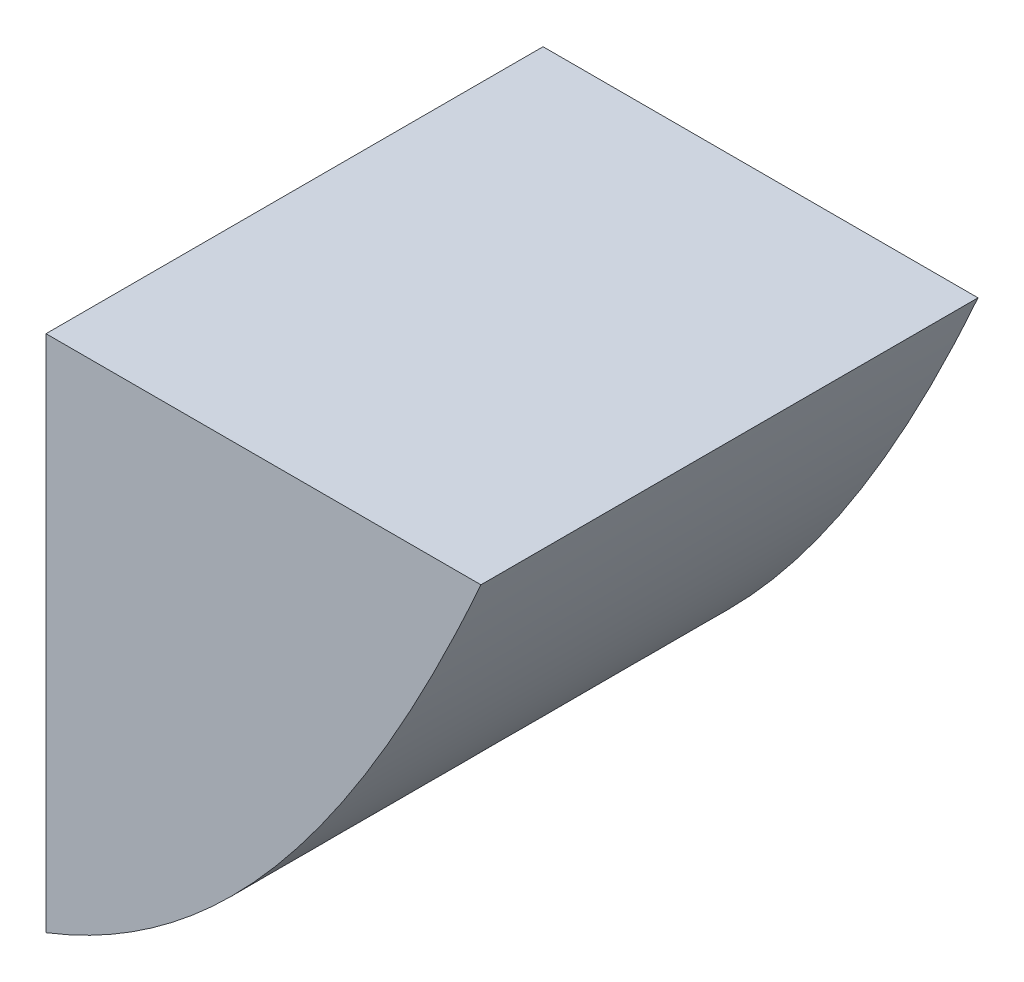
ISO-10303-21;
HEADER;
FILE_DESCRIPTION(('STEP AP214'),'2;1');
FILE_NAME('part.step','',(''),(''),'','','');
FILE_SCHEMA(('AUTOMOTIVE_DESIGN { 1 0 10303 214 1 1 1 1 }'));
ENDSEC;
DATA;
#1=APPLICATION_CONTEXT('core data for automotive mechanical design processes');
#2=APPLICATION_PROTOCOL_DEFINITION('international standard','automotive_design',2000,#1);
#3=PRODUCT_CONTEXT('',#1,'mechanical');
#4=PRODUCT('Part','Part','',(#3));
#5=PRODUCT_RELATED_PRODUCT_CATEGORY('part','',(#4));
#6=PRODUCT_DEFINITION_FORMATION('','',#4);
#7=PRODUCT_DEFINITION_CONTEXT('part definition',#1,'design');
#8=PRODUCT_DEFINITION('design','',#6,#7);
#9=PRODUCT_DEFINITION_SHAPE('','',#8);
#10=(LENGTH_UNIT() NAMED_UNIT(*) SI_UNIT(.MILLI.,.METRE.));
#11=(NAMED_UNIT(*) PLANE_ANGLE_UNIT() SI_UNIT($,.RADIAN.));
#12=(NAMED_UNIT(*) SI_UNIT($,.STERADIAN.) SOLID_ANGLE_UNIT());
#13=UNCERTAINTY_MEASURE_WITH_UNIT(LENGTH_MEASURE(1.E-05),#10,'distance_accuracy_value','');
#14=(GEOMETRIC_REPRESENTATION_CONTEXT(3) GLOBAL_UNCERTAINTY_ASSIGNED_CONTEXT((#13)) GLOBAL_UNIT_ASSIGNED_CONTEXT((#10,
#11,#12)) REPRESENTATION_CONTEXT('',''));
#15=CARTESIAN_POINT('',(0.,0.,0.));
#16=DIRECTION('',(0.,0.,1.));
#17=DIRECTION('',(1.,0.,0.));
#18=AXIS2_PLACEMENT_3D('',#15,#16,#17);
#19=CARTESIAN_POINT('',(0.,0.,8.));
#20=CARTESIAN_POINT('',(4.,0.,8.));
#21=CARTESIAN_POINT('',(8.,0.,8.));
#22=CARTESIAN_POINT('',(12.,9.,8.));
#23=B_SPLINE_CURVE_WITH_KNOTS('',3,(#19,#20,#21,#22),.UNSPECIFIED.,.F.,.F.,(4,4),(0.,1.),.UNSPECIFIED.);
#24=DIRECTION('',(0.,0.,-1.));
#25=VECTOR('',#24,1.);
#26=SURFACE_OF_LINEAR_EXTRUSION('',#23,#25);
#27=DIRECTION('',(0.,0.,-1.));
#28=VECTOR('',#27,1.);
#29=CARTESIAN_POINT('',(5.,0.651041666666666,8.));
#30=LINE('',#29,#28);
#31=CARTESIAN_POINT('',(5.,0.651041666666666,0.));
#32=VERTEX_POINT('',#31);
#33=CARTESIAN_POINT('',(5.,0.651041666666666,8.));
#34=VERTEX_POINT('',#33);
#35=EDGE_CURVE('E76',#32,#34,#30,.F.);
#36=ORIENTED_EDGE('',*,*,#35,.F.);
#37=CARTESIAN_POINT('',(0.,0.,0.));
#38=CARTESIAN_POINT('',(4.,0.,0.));
#39=CARTESIAN_POINT('',(8.,0.,0.));
#40=CARTESIAN_POINT('',(12.,9.,0.));
#41=B_SPLINE_CURVE_WITH_KNOTS('',3,(#37,#38,#39,#40),.UNSPECIFIED.,.F.,.F.,(4,4),(0.,1.),.UNSPECIFIED.);
#42=CARTESIAN_POINT('',(12.,9.,0.));
#43=VERTEX_POINT('',#42);
#44=EDGE_CURVE('E83',#32,#43,#41,.T.);
#45=ORIENTED_EDGE('',*,*,#44,.T.);
#46=DIRECTION('',(0.,0.,-1.));
#47=VECTOR('',#46,1.);
#48=CARTESIAN_POINT('',(12.,9.,8.));
#49=LINE('',#48,#47);
#50=CARTESIAN_POINT('',(12.,9.,8.));
#51=VERTEX_POINT('',#50);
#52=EDGE_CURVE('E49',#51,#43,#49,.T.);
#53=ORIENTED_EDGE('',*,*,#52,.F.);
#54=EDGE_CURVE('E64',#34,#51,#23,.T.);
#55=ORIENTED_EDGE('',*,*,#54,.F.);
#56=EDGE_LOOP('',(#36,#45,#53,#55));
#57=FACE_BOUND('',#56,.T.);
#58=ADVANCED_FACE('F41',(#57),#26,.F.);
#59=CARTESIAN_POINT('',(12.,9.,8.));
#60=DIRECTION('',(0.,-1.,0.));
#61=DIRECTION('',(0.,0.,-1.));
#62=AXIS2_PLACEMENT_3D('',#59,#60,#61);
#63=PLANE('',#62);
#64=DIRECTION('',(0.,0.,-1.));
#65=VECTOR('',#64,1.);
#66=CARTESIAN_POINT('',(5.,9.,8.));
#67=LINE('',#66,#65);
#68=CARTESIAN_POINT('',(5.,9.,8.));
#69=VERTEX_POINT('',#68);
#70=CARTESIAN_POINT('',(5.,9.,0.));
#71=VERTEX_POINT('',#70);
#72=EDGE_CURVE('E56',#69,#71,#67,.T.);
#73=ORIENTED_EDGE('',*,*,#72,.F.);
#74=DIRECTION('',(-1.,0.,0.));
#75=VECTOR('',#74,1.);
#76=CARTESIAN_POINT('',(12.,9.,8.));
#77=LINE('',#76,#75);
#78=EDGE_CURVE('E93',#51,#69,#77,.T.);
#79=ORIENTED_EDGE('',*,*,#78,.F.);
#80=ORIENTED_EDGE('',*,*,#52,.T.);
#81=DIRECTION('',(-1.,0.,0.));
#82=VECTOR('',#81,1.);
#83=CARTESIAN_POINT('',(12.,9.,0.));
#84=LINE('',#83,#82);
#85=EDGE_CURVE('E86',#43,#71,#84,.T.);
#86=ORIENTED_EDGE('',*,*,#85,.T.);
#87=EDGE_LOOP('',(#73,#79,#80,#86));
#88=FACE_BOUND('',#87,.T.);
#89=ADVANCED_FACE('F107',(#88),#63,.F.);
#90=CARTESIAN_POINT('',(6.,1.125,8.));
#91=DIRECTION('',(0.,0.,-1.));
#92=DIRECTION('',(-1.,0.,0.));
#93=AXIS2_PLACEMENT_3D('',#90,#91,#92);
#94=PLANE('',#93);
#95=DIRECTION('',(0.,1.,0.));
#96=VECTOR('',#95,1.);
#97=CARTESIAN_POINT('',(5.,-2.,8.));
#98=LINE('',#97,#96);
#99=EDGE_CURVE('E106',#34,#69,#98,.T.);
#100=ORIENTED_EDGE('',*,*,#99,.F.);
#101=ORIENTED_EDGE('',*,*,#54,.T.);
#102=ORIENTED_EDGE('',*,*,#78,.T.);
#103=EDGE_LOOP('',(#100,#101,#102));
#104=FACE_BOUND('',#103,.T.);
#105=ADVANCED_FACE('F109',(#104),#94,.F.);
#106=CARTESIAN_POINT('',(6.,1.125,0.));
#107=DIRECTION('',(0.,0.,-1.));
#108=DIRECTION('',(-1.,0.,0.));
#109=AXIS2_PLACEMENT_3D('',#106,#107,#108);
#110=PLANE('',#109);
#111=ORIENTED_EDGE('',*,*,#44,.F.);
#112=DIRECTION('',(0.,1.,0.));
#113=VECTOR('',#112,1.);
#114=CARTESIAN_POINT('',(5.,1.125,0.));
#115=LINE('',#114,#113);
#116=EDGE_CURVE('E11',#32,#71,#115,.T.);
#117=ORIENTED_EDGE('',*,*,#116,.T.);
#118=ORIENTED_EDGE('',*,*,#85,.F.);
#119=EDGE_LOOP('',(#111,#117,#118));
#120=FACE_BOUND('',#119,.T.);
#121=ADVANCED_FACE('F85',(#120),#110,.T.);
#122=CARTESIAN_POINT('',(5.,-2.,8.));
#123=DIRECTION('',(-1.,0.,0.));
#124=DIRECTION('',(0.,0.,1.));
#125=AXIS2_PLACEMENT_3D('',#122,#123,#124);
#126=PLANE('',#125);
#127=ORIENTED_EDGE('',*,*,#35,.T.);
#128=ORIENTED_EDGE('',*,*,#99,.T.);
#129=ORIENTED_EDGE('',*,*,#72,.T.);
#130=ORIENTED_EDGE('',*,*,#116,.F.);
#131=EDGE_LOOP('',(#127,#128,#129,#130));
#132=FACE_BOUND('',#131,.T.);
#133=ADVANCED_FACE('F75',(#132),#126,.T.);
#134=CLOSED_SHELL('',(#58,#89,#105,#121,#133));
#135=MANIFOLD_SOLID_BREP('B2',#134);
#136=ADVANCED_BREP_SHAPE_REPRESENTATION('',(#18,#135),#14);
#137=SHAPE_DEFINITION_REPRESENTATION(#9,#136);
ENDSEC;
END-ISO-10303-21;
